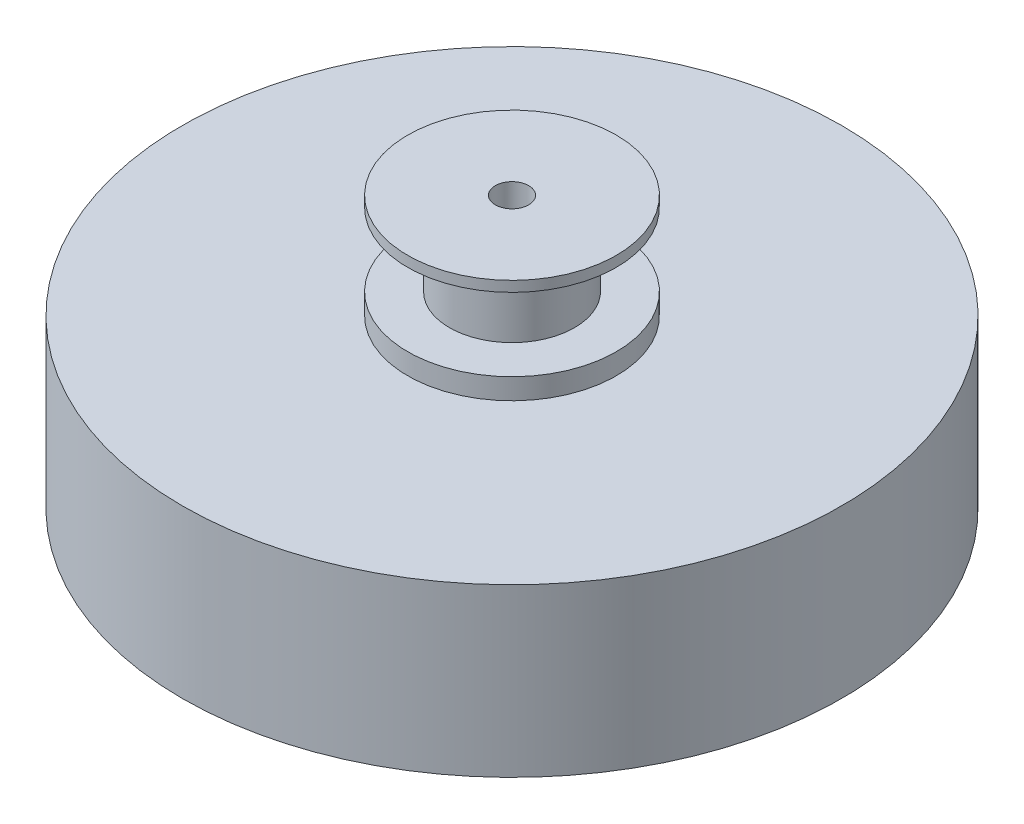
ISO-10303-21;
HEADER;
FILE_DESCRIPTION(('STEP AP214'),'2;1');
FILE_NAME('part.step','',(''),(''),'','','');
FILE_SCHEMA(('AUTOMOTIVE_DESIGN { 1 0 10303 214 1 1 1 1 }'));
ENDSEC;
DATA;
#1=APPLICATION_CONTEXT('core data for automotive mechanical design processes');
#2=APPLICATION_PROTOCOL_DEFINITION('international standard','automotive_design',2000,#1);
#3=PRODUCT_CONTEXT('',#1,'mechanical');
#4=PRODUCT('Part','Part','',(#3));
#5=PRODUCT_RELATED_PRODUCT_CATEGORY('part','',(#4));
#6=PRODUCT_DEFINITION_FORMATION('','',#4);
#7=PRODUCT_DEFINITION_CONTEXT('part definition',#1,'design');
#8=PRODUCT_DEFINITION('design','',#6,#7);
#9=PRODUCT_DEFINITION_SHAPE('','',#8);
#10=(LENGTH_UNIT() NAMED_UNIT(*) SI_UNIT(.MILLI.,.METRE.));
#11=(NAMED_UNIT(*) PLANE_ANGLE_UNIT() SI_UNIT($,.RADIAN.));
#12=(NAMED_UNIT(*) SI_UNIT($,.STERADIAN.) SOLID_ANGLE_UNIT());
#13=UNCERTAINTY_MEASURE_WITH_UNIT(LENGTH_MEASURE(1.E-05),#10,'distance_accuracy_value','');
#14=(GEOMETRIC_REPRESENTATION_CONTEXT(3) GLOBAL_UNCERTAINTY_ASSIGNED_CONTEXT((#13)) GLOBAL_UNIT_ASSIGNED_CONTEXT((#10,
#11,#12)) REPRESENTATION_CONTEXT('',''));
#15=CARTESIAN_POINT('',(0.,0.,0.));
#16=DIRECTION('',(0.,0.,1.));
#17=DIRECTION('',(1.,0.,0.));
#18=AXIS2_PLACEMENT_3D('',#15,#16,#17);
#19=CARTESIAN_POINT('',(0.,-40.0000000000002,158.));
#20=DIRECTION('',(0.,1.,0.));
#21=DIRECTION('',(0.,0.,1.));
#22=AXIS2_PLACEMENT_3D('',#19,#20,#21);
#23=PLANE('',#22);
#24=CARTESIAN_POINT('',(0.,-40.,-1.3720995995543E-13));
#25=DIRECTION('',(0.,-1.,0.));
#26=DIRECTION('',(0.,0.,-1.));
#27=AXIS2_PLACEMENT_3D('',#24,#25,#26);
#28=CIRCLE('',#27,50.0000000000001);
#29=CARTESIAN_POINT('',(0.,-39.9999999999999,-50.0000000000003));
#30=VERTEX_POINT('',#29);
#31=EDGE_CURVE('E140',#30,#30,#28,.T.);
#32=ORIENTED_EDGE('',*,*,#31,.F.);
#33=EDGE_LOOP('',(#32));
#34=FACE_BOUND('',#33,.T.);
#35=CARTESIAN_POINT('',(0.,-39.9999999999991,-1.37209959955427E-13));
#36=DIRECTION('',(0.,-1.,0.));
#37=DIRECTION('',(0.,0.,-1.));
#38=AXIS2_PLACEMENT_3D('',#35,#36,#37);
#39=CIRCLE('',#38,158.);
#40=CARTESIAN_POINT('',(0.,-39.9999999999986,-158.));
#41=VERTEX_POINT('',#40);
#42=EDGE_CURVE('E11',#41,#41,#39,.T.);
#43=ORIENTED_EDGE('',*,*,#42,.T.);
#44=EDGE_LOOP('',(#43));
#45=FACE_BOUND('',#44,.T.);
#46=ADVANCED_FACE('F73',(#34,#45),#23,.F.);
#47=CARTESIAN_POINT('',(0.,-5577.83915172928,-1.91333771661652E-11));
#48=DIRECTION('',(0.,-1.,0.));
#49=DIRECTION('',(0.,0.,-1.));
#50=AXIS2_PLACEMENT_3D('',#47,#48,#49);
#51=CYLINDRICAL_SURFACE('',#50,158.);
#52=ORIENTED_EDGE('',*,*,#42,.F.);
#53=EDGE_LOOP('',(#52));
#54=FACE_BOUND('',#53,.T.);
#55=CARTESIAN_POINT('',(0.,40.0000000000009,1.37209959955436E-13));
#56=DIRECTION('',(0.,-1.,0.));
#57=DIRECTION('',(0.,0.,-1.));
#58=AXIS2_PLACEMENT_3D('',#55,#56,#57);
#59=CIRCLE('',#58,158.);
#60=CARTESIAN_POINT('',(0.,40.0000000000015,-158.));
#61=VERTEX_POINT('',#60);
#62=EDGE_CURVE('E80',#61,#61,#59,.T.);
#63=ORIENTED_EDGE('',*,*,#62,.T.);
#64=EDGE_LOOP('',(#63));
#65=FACE_BOUND('',#64,.T.);
#66=ADVANCED_FACE('F148',(#54,#65),#51,.T.);
#67=CARTESIAN_POINT('',(0.,40.0000000000002,50.));
#68=DIRECTION('',(0.,-1.,0.));
#69=DIRECTION('',(0.,0.,-1.));
#70=AXIS2_PLACEMENT_3D('',#67,#68,#69);
#71=PLANE('',#70);
#72=ORIENTED_EDGE('',*,*,#62,.F.);
#73=EDGE_LOOP('',(#72));
#74=FACE_BOUND('',#73,.T.);
#75=CARTESIAN_POINT('',(0.,40.,1.37209959955433E-13));
#76=DIRECTION('',(0.,-1.,0.));
#77=DIRECTION('',(0.,0.,-1.));
#78=AXIS2_PLACEMENT_3D('',#75,#76,#77);
#79=CIRCLE('',#78,49.9999999999999);
#80=CARTESIAN_POINT('',(0.,40.0000000000002,-49.9999999999997));
#81=VERTEX_POINT('',#80);
#82=EDGE_CURVE('E85',#81,#81,#79,.T.);
#83=ORIENTED_EDGE('',*,*,#82,.T.);
#84=EDGE_LOOP('',(#83));
#85=FACE_BOUND('',#84,.T.);
#86=ADVANCED_FACE('F152',(#74,#85),#71,.F.);
#87=CARTESIAN_POINT('',(0.,-5577.83915172928,-1.91333771661652E-11));
#88=DIRECTION('',(0.,-1.,0.));
#89=DIRECTION('',(0.,0.,-1.));
#90=AXIS2_PLACEMENT_3D('',#87,#88,#89);
#91=CYLINDRICAL_SURFACE('',#90,49.9999999999999);
#92=ORIENTED_EDGE('',*,*,#82,.F.);
#93=EDGE_LOOP('',(#92));
#94=FACE_BOUND('',#93,.T.);
#95=CARTESIAN_POINT('',(0.,49.9999999999998,1.71512449944289E-13));
#96=DIRECTION('',(0.,-1.,0.));
#97=DIRECTION('',(0.,0.,-1.));
#98=AXIS2_PLACEMENT_3D('',#95,#96,#97);
#99=CIRCLE('',#98,49.9999999999998);
#100=CARTESIAN_POINT('',(0.,50.,-49.9999999999997));
#101=VERTEX_POINT('',#100);
#102=EDGE_CURVE('E90',#101,#101,#99,.T.);
#103=ORIENTED_EDGE('',*,*,#102,.T.);
#104=EDGE_LOOP('',(#103));
#105=FACE_BOUND('',#104,.T.);
#106=ADVANCED_FACE('F157',(#94,#105),#91,.T.);
#107=CARTESIAN_POINT('',(0.,50.,50.));
#108=DIRECTION('',(0.,-1.,0.));
#109=DIRECTION('',(0.,0.,-1.));
#110=AXIS2_PLACEMENT_3D('',#107,#108,#109);
#111=PLANE('',#110);
#112=ORIENTED_EDGE('',*,*,#102,.F.);
#113=EDGE_LOOP('',(#112));
#114=FACE_BOUND('',#113,.T.);
#115=CARTESIAN_POINT('',(0.,49.9999999999998,1.71512449944289E-13));
#116=DIRECTION('',(0.,-1.,0.));
#117=DIRECTION('',(0.,0.,-1.));
#118=AXIS2_PLACEMENT_3D('',#115,#116,#117);
#119=CIRCLE('',#118,29.9999999999998);
#120=CARTESIAN_POINT('',(0.,49.9999999999999,-29.9999999999997));
#121=VERTEX_POINT('',#120);
#122=EDGE_CURVE('E96',#121,#121,#119,.T.);
#123=ORIENTED_EDGE('',*,*,#122,.T.);
#124=EDGE_LOOP('',(#123));
#125=FACE_BOUND('',#124,.T.);
#126=ADVANCED_FACE('F163',(#114,#125),#111,.F.);
#127=CARTESIAN_POINT('',(0.,-5577.83915172928,-1.91333771661652E-11));
#128=DIRECTION('',(0.,-1.,0.));
#129=DIRECTION('',(0.,0.,-1.));
#130=AXIS2_PLACEMENT_3D('',#127,#128,#129);
#131=CYLINDRICAL_SURFACE('',#130,29.9999999999998);
#132=ORIENTED_EDGE('',*,*,#122,.F.);
#133=EDGE_LOOP('',(#132));
#134=FACE_BOUND('',#133,.T.);
#135=CARTESIAN_POINT('',(0.,85.,2.91571164905291E-13));
#136=DIRECTION('',(0.,-1.,0.));
#137=DIRECTION('',(0.,0.,-1.));
#138=AXIS2_PLACEMENT_3D('',#135,#136,#137);
#139=CIRCLE('',#138,29.9999999999997);
#140=CARTESIAN_POINT('',(0.,85.0000000000001,-29.9999999999994));
#141=VERTEX_POINT('',#140);
#142=EDGE_CURVE('E100',#141,#141,#139,.T.);
#143=ORIENTED_EDGE('',*,*,#142,.T.);
#144=EDGE_LOOP('',(#143));
#145=FACE_BOUND('',#144,.T.);
#146=ADVANCED_FACE('F167',(#134,#145),#131,.T.);
#147=CARTESIAN_POINT('',(0.,85.,30.));
#148=DIRECTION('',(0.,1.,0.));
#149=DIRECTION('',(0.,0.,1.));
#150=AXIS2_PLACEMENT_3D('',#147,#148,#149);
#151=PLANE('',#150);
#152=ORIENTED_EDGE('',*,*,#142,.F.);
#153=EDGE_LOOP('',(#152));
#154=FACE_BOUND('',#153,.T.);
#155=CARTESIAN_POINT('',(0.,85.,2.91571164905291E-13));
#156=DIRECTION('',(0.,-1.,0.));
#157=DIRECTION('',(0.,0.,-1.));
#158=AXIS2_PLACEMENT_3D('',#155,#156,#157);
#159=CIRCLE('',#158,49.9999999999997);
#160=CARTESIAN_POINT('',(0.,85.0000000000001,-49.9999999999994));
#161=VERTEX_POINT('',#160);
#162=EDGE_CURVE('E104',#161,#161,#159,.T.);
#163=ORIENTED_EDGE('',*,*,#162,.T.);
#164=EDGE_LOOP('',(#163));
#165=FACE_BOUND('',#164,.T.);
#166=ADVANCED_FACE('F171',(#154,#165),#151,.F.);
#167=CARTESIAN_POINT('',(0.,-5577.83915172928,-1.91333771661652E-11));
#168=DIRECTION('',(0.,-1.,0.));
#169=DIRECTION('',(0.,0.,-1.));
#170=AXIS2_PLACEMENT_3D('',#167,#168,#169);
#171=CYLINDRICAL_SURFACE('',#170,49.9999999999997);
#172=ORIENTED_EDGE('',*,*,#162,.F.);
#173=EDGE_LOOP('',(#172));
#174=FACE_BOUND('',#173,.T.);
#175=CARTESIAN_POINT('',(0.,89.9999999999999,3.08722409899722E-13));
#176=DIRECTION('',(0.,-1.,0.));
#177=DIRECTION('',(0.,0.,-1.));
#178=AXIS2_PLACEMENT_3D('',#175,#176,#177);
#179=CIRCLE('',#178,49.9999999999997);
#180=CARTESIAN_POINT('',(0.,90.,-49.9999999999994));
#181=VERTEX_POINT('',#180);
#182=EDGE_CURVE('E108',#181,#181,#179,.T.);
#183=ORIENTED_EDGE('',*,*,#182,.T.);
#184=EDGE_LOOP('',(#183));
#185=FACE_BOUND('',#184,.T.);
#186=ADVANCED_FACE('F175',(#174,#185),#171,.T.);
#187=CARTESIAN_POINT('',(0.,89.9999999999999,50.));
#188=DIRECTION('',(0.,-1.,0.));
#189=DIRECTION('',(0.,0.,-1.));
#190=AXIS2_PLACEMENT_3D('',#187,#188,#189);
#191=PLANE('',#190);
#192=ORIENTED_EDGE('',*,*,#182,.F.);
#193=EDGE_LOOP('',(#192));
#194=FACE_BOUND('',#193,.T.);
#195=CARTESIAN_POINT('',(0.,89.9999999999999,3.08722409899722E-13));
#196=DIRECTION('',(0.,-1.,0.));
#197=DIRECTION('',(0.,0.,-1.));
#198=AXIS2_PLACEMENT_3D('',#195,#196,#197);
#199=CIRCLE('',#198,7.99999999999971);
#200=CARTESIAN_POINT('',(0.,89.9999999999999,-7.9999999999994));
#201=VERTEX_POINT('',#200);
#202=EDGE_CURVE('E112',#201,#201,#199,.T.);
#203=ORIENTED_EDGE('',*,*,#202,.T.);
#204=EDGE_LOOP('',(#203));
#205=FACE_BOUND('',#204,.T.);
#206=ADVANCED_FACE('F179',(#194,#205),#191,.F.);
#207=CARTESIAN_POINT('',(0.,-5577.83915172928,-1.91333771661652E-11));
#208=DIRECTION('',(0.,-1.,0.));
#209=DIRECTION('',(0.,0.,-1.));
#210=AXIS2_PLACEMENT_3D('',#207,#208,#209);
#211=CYLINDRICAL_SURFACE('',#210,8.00000000000001);
#212=ORIENTED_EDGE('',*,*,#202,.F.);
#213=EDGE_LOOP('',(#212));
#214=FACE_BOUND('',#213,.T.);
#215=CARTESIAN_POINT('',(0.,-89.9999999999999,-3.08722409899716E-13));
#216=DIRECTION('',(0.,-1.,0.));
#217=DIRECTION('',(0.,0.,-1.));
#218=AXIS2_PLACEMENT_3D('',#215,#216,#217);
#219=CIRCLE('',#218,8.00000000000031);
#220=CARTESIAN_POINT('',(0.,-89.9999999999998,-8.00000000000062));
#221=VERTEX_POINT('',#220);
#222=EDGE_CURVE('E116',#221,#221,#219,.T.);
#223=ORIENTED_EDGE('',*,*,#222,.T.);
#224=EDGE_LOOP('',(#223));
#225=FACE_BOUND('',#224,.T.);
#226=ADVANCED_FACE('F183',(#214,#225),#211,.F.);
#227=CARTESIAN_POINT('',(0.,-90.0000000000001,50.));
#228=DIRECTION('',(0.,1.,0.));
#229=DIRECTION('',(0.,0.,1.));
#230=AXIS2_PLACEMENT_3D('',#227,#228,#229);
#231=PLANE('',#230);
#232=ORIENTED_EDGE('',*,*,#222,.F.);
#233=EDGE_LOOP('',(#232));
#234=FACE_BOUND('',#233,.T.);
#235=CARTESIAN_POINT('',(0.,-89.9999999999999,-3.08722409899716E-13));
#236=DIRECTION('',(0.,-1.,0.));
#237=DIRECTION('',(0.,0.,-1.));
#238=AXIS2_PLACEMENT_3D('',#235,#236,#237);
#239=CIRCLE('',#238,50.0000000000003);
#240=CARTESIAN_POINT('',(0.,-89.9999999999997,-50.0000000000006));
#241=VERTEX_POINT('',#240);
#242=EDGE_CURVE('E120',#241,#241,#239,.T.);
#243=ORIENTED_EDGE('',*,*,#242,.T.);
#244=EDGE_LOOP('',(#243));
#245=FACE_BOUND('',#244,.T.);
#246=ADVANCED_FACE('F187',(#234,#245),#231,.F.);
#247=CARTESIAN_POINT('',(0.,-5577.83915172928,-1.91333771661652E-11));
#248=DIRECTION('',(0.,-1.,0.));
#249=DIRECTION('',(0.,0.,-1.));
#250=AXIS2_PLACEMENT_3D('',#247,#248,#249);
#251=CYLINDRICAL_SURFACE('',#250,50.0000000000003);
#252=ORIENTED_EDGE('',*,*,#242,.F.);
#253=EDGE_LOOP('',(#252));
#254=FACE_BOUND('',#253,.T.);
#255=CARTESIAN_POINT('',(0.,-85.,-2.91571164905288E-13));
#256=DIRECTION('',(0.,-1.,0.));
#257=DIRECTION('',(0.,0.,-1.));
#258=AXIS2_PLACEMENT_3D('',#255,#256,#257);
#259=CIRCLE('',#258,50.0000000000003);
#260=CARTESIAN_POINT('',(0.,-84.9999999999998,-50.0000000000006));
#261=VERTEX_POINT('',#260);
#262=EDGE_CURVE('E124',#261,#261,#259,.T.);
#263=ORIENTED_EDGE('',*,*,#262,.T.);
#264=EDGE_LOOP('',(#263));
#265=FACE_BOUND('',#264,.T.);
#266=ADVANCED_FACE('F191',(#254,#265),#251,.T.);
#267=CARTESIAN_POINT('',(0.,-84.9999999999999,30.));
#268=DIRECTION('',(0.,-1.,0.));
#269=DIRECTION('',(0.,0.,-1.));
#270=AXIS2_PLACEMENT_3D('',#267,#268,#269);
#271=PLANE('',#270);
#272=ORIENTED_EDGE('',*,*,#262,.F.);
#273=EDGE_LOOP('',(#272));
#274=FACE_BOUND('',#273,.T.);
#275=CARTESIAN_POINT('',(0.,-85.,-2.91571164905288E-13));
#276=DIRECTION('',(0.,-1.,0.));
#277=DIRECTION('',(0.,0.,-1.));
#278=AXIS2_PLACEMENT_3D('',#275,#276,#277);
#279=CIRCLE('',#278,30.0000000000003);
#280=CARTESIAN_POINT('',(0.,-84.9999999999999,-30.0000000000006));
#281=VERTEX_POINT('',#280);
#282=EDGE_CURVE('E128',#281,#281,#279,.T.);
#283=ORIENTED_EDGE('',*,*,#282,.T.);
#284=EDGE_LOOP('',(#283));
#285=FACE_BOUND('',#284,.T.);
#286=ADVANCED_FACE('F195',(#274,#285),#271,.F.);
#287=CARTESIAN_POINT('',(0.,-5577.83915172928,-1.91333771661652E-11));
#288=DIRECTION('',(0.,-1.,0.));
#289=DIRECTION('',(0.,0.,-1.));
#290=AXIS2_PLACEMENT_3D('',#287,#288,#289);
#291=CYLINDRICAL_SURFACE('',#290,30.0000000000002);
#292=ORIENTED_EDGE('',*,*,#282,.F.);
#293=EDGE_LOOP('',(#292));
#294=FACE_BOUND('',#293,.T.);
#295=CARTESIAN_POINT('',(0.,-49.9999999999998,-1.71512449944286E-13));
#296=DIRECTION('',(0.,-1.,0.));
#297=DIRECTION('',(0.,0.,-1.));
#298=AXIS2_PLACEMENT_3D('',#295,#296,#297);
#299=CIRCLE('',#298,30.0000000000002);
#300=CARTESIAN_POINT('',(0.,-49.9999999999997,-30.0000000000003));
#301=VERTEX_POINT('',#300);
#302=EDGE_CURVE('E132',#301,#301,#299,.T.);
#303=ORIENTED_EDGE('',*,*,#302,.T.);
#304=EDGE_LOOP('',(#303));
#305=FACE_BOUND('',#304,.T.);
#306=ADVANCED_FACE('F199',(#294,#305),#291,.T.);
#307=CARTESIAN_POINT('',(0.,-50.,50.));
#308=DIRECTION('',(0.,1.,0.));
#309=DIRECTION('',(0.,0.,1.));
#310=AXIS2_PLACEMENT_3D('',#307,#308,#309);
#311=PLANE('',#310);
#312=ORIENTED_EDGE('',*,*,#302,.F.);
#313=EDGE_LOOP('',(#312));
#314=FACE_BOUND('',#313,.T.);
#315=CARTESIAN_POINT('',(0.,-49.9999999999998,-1.71512449944286E-13));
#316=DIRECTION('',(0.,-1.,0.));
#317=DIRECTION('',(0.,0.,-1.));
#318=AXIS2_PLACEMENT_3D('',#315,#316,#317);
#319=CIRCLE('',#318,50.0000000000002);
#320=CARTESIAN_POINT('',(0.,-49.9999999999997,-50.0000000000003));
#321=VERTEX_POINT('',#320);
#322=EDGE_CURVE('E136',#321,#321,#319,.T.);
#323=ORIENTED_EDGE('',*,*,#322,.T.);
#324=EDGE_LOOP('',(#323));
#325=FACE_BOUND('',#324,.T.);
#326=ADVANCED_FACE('F203',(#314,#325),#311,.F.);
#327=CARTESIAN_POINT('',(0.,-5577.83915172928,-1.91333771661652E-11));
#328=DIRECTION('',(0.,-1.,0.));
#329=DIRECTION('',(0.,0.,-1.));
#330=AXIS2_PLACEMENT_3D('',#327,#328,#329);
#331=CYLINDRICAL_SURFACE('',#330,50.0000000000001);
#332=ORIENTED_EDGE('',*,*,#322,.F.);
#333=EDGE_LOOP('',(#332));
#334=FACE_BOUND('',#333,.T.);
#335=ORIENTED_EDGE('',*,*,#31,.T.);
#336=EDGE_LOOP('',(#335));
#337=FACE_BOUND('',#336,.T.);
#338=ADVANCED_FACE('F145',(#334,#337),#331,.T.);
#339=CLOSED_SHELL('',(#46,#66,#86,#106,#126,#146,#166,#186,#206,#226,#246,#266,#286,#306,#326,#338));
#340=MANIFOLD_SOLID_BREP('B2',#339);
#341=ADVANCED_BREP_SHAPE_REPRESENTATION('',(#18,#340),#14);
#342=SHAPE_DEFINITION_REPRESENTATION(#9,#341);
ENDSEC;
END-ISO-10303-21;
